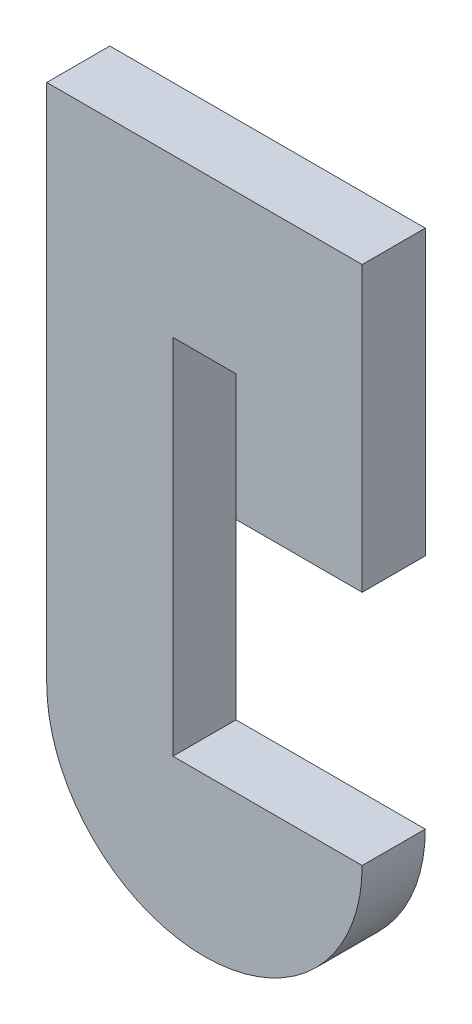
ISO-10303-21;
HEADER;
FILE_DESCRIPTION(('STEP AP214'),'2;1');
FILE_NAME('part.step','',(''),(''),'','','');
FILE_SCHEMA(('AUTOMOTIVE_DESIGN { 1 0 10303 214 1 1 1 1 }'));
ENDSEC;
DATA;
#1=APPLICATION_CONTEXT('core data for automotive mechanical design processes');
#2=APPLICATION_PROTOCOL_DEFINITION('international standard','automotive_design',2000,#1);
#3=PRODUCT_CONTEXT('',#1,'mechanical');
#4=PRODUCT('Part','Part','',(#3));
#5=PRODUCT_RELATED_PRODUCT_CATEGORY('part','',(#4));
#6=PRODUCT_DEFINITION_FORMATION('','',#4);
#7=PRODUCT_DEFINITION_CONTEXT('part definition',#1,'design');
#8=PRODUCT_DEFINITION('design','',#6,#7);
#9=PRODUCT_DEFINITION_SHAPE('','',#8);
#10=(LENGTH_UNIT() NAMED_UNIT(*) SI_UNIT(.MILLI.,.METRE.));
#11=(NAMED_UNIT(*) PLANE_ANGLE_UNIT() SI_UNIT($,.RADIAN.));
#12=(NAMED_UNIT(*) SI_UNIT($,.STERADIAN.) SOLID_ANGLE_UNIT());
#13=UNCERTAINTY_MEASURE_WITH_UNIT(LENGTH_MEASURE(1.E-05),#10,'distance_accuracy_value','');
#14=(GEOMETRIC_REPRESENTATION_CONTEXT(3) GLOBAL_UNCERTAINTY_ASSIGNED_CONTEXT((#13)) GLOBAL_UNIT_ASSIGNED_CONTEXT((#10,
#11,#12)) REPRESENTATION_CONTEXT('',''));
#15=CARTESIAN_POINT('',(0.,0.,0.));
#16=DIRECTION('',(0.,0.,1.));
#17=DIRECTION('',(1.,0.,0.));
#18=AXIS2_PLACEMENT_3D('',#15,#16,#17);
#19=CARTESIAN_POINT('',(12.7,-27.305,5.08));
#20=DIRECTION('',(-1.,0.,0.));
#21=DIRECTION('',(0.,0.,1.));
#22=AXIS2_PLACEMENT_3D('',#19,#20,#21);
#23=PLANE('',#22);
#24=DIRECTION('',(0.,1.,0.));
#25=VECTOR('',#24,1.);
#26=CARTESIAN_POINT('',(12.7,-27.305,5.08));
#27=LINE('',#26,#25);
#28=CARTESIAN_POINT('',(12.7,4.445,5.08));
#29=VERTEX_POINT('',#28);
#30=CARTESIAN_POINT('',(12.7,27.305,5.08));
#31=VERTEX_POINT('',#30);
#32=EDGE_CURVE('E143',#29,#31,#27,.T.);
#33=ORIENTED_EDGE('',*,*,#32,.F.);
#34=DIRECTION('',(0.,0.,1.));
#35=VECTOR('',#34,1.);
#36=CARTESIAN_POINT('',(12.7,4.445,-7.62));
#37=LINE('',#36,#35);
#38=CARTESIAN_POINT('',(12.7,4.445,0.));
#39=VERTEX_POINT('',#38);
#40=EDGE_CURVE('E126',#39,#29,#37,.T.);
#41=ORIENTED_EDGE('',*,*,#40,.F.);
#42=DIRECTION('',(0.,1.,0.));
#43=VECTOR('',#42,1.);
#44=CARTESIAN_POINT('',(12.7,-27.305,0.));
#45=LINE('',#44,#43);
#46=CARTESIAN_POINT('',(12.7,27.305,0.));
#47=VERTEX_POINT('',#46);
#48=EDGE_CURVE('E151',#39,#47,#45,.T.);
#49=ORIENTED_EDGE('',*,*,#48,.T.);
#50=DIRECTION('',(0.,0.,-1.));
#51=VECTOR('',#50,1.);
#52=CARTESIAN_POINT('',(12.7,27.305,5.08));
#53=LINE('',#52,#51);
#54=EDGE_CURVE('E159',#31,#47,#53,.T.);
#55=ORIENTED_EDGE('',*,*,#54,.F.);
#56=EDGE_LOOP('',(#33,#41,#49,#55));
#57=FACE_BOUND('',#56,.T.);
#58=ADVANCED_FACE('F32',(#57),#23,.F.);
#59=CARTESIAN_POINT('',(-12.7,27.305,5.08));
#60=DIRECTION('',(0.,-1.,0.));
#61=DIRECTION('',(0.,0.,-1.));
#62=AXIS2_PLACEMENT_3D('',#59,#60,#61);
#63=PLANE('',#62);
#64=DIRECTION('',(-1.,0.,0.));
#65=VECTOR('',#64,1.);
#66=CARTESIAN_POINT('',(-12.7,27.305,0.));
#67=LINE('',#66,#65);
#68=CARTESIAN_POINT('',(-12.7,27.305,0.));
#69=VERTEX_POINT('',#68);
#70=EDGE_CURVE('E153',#47,#69,#67,.T.);
#71=ORIENTED_EDGE('',*,*,#70,.T.);
#72=DIRECTION('',(0.,0.,-1.));
#73=VECTOR('',#72,1.);
#74=CARTESIAN_POINT('',(-12.7,27.305,5.08));
#75=LINE('',#74,#73);
#76=CARTESIAN_POINT('',(-12.7,27.305,5.08));
#77=VERTEX_POINT('',#76);
#78=EDGE_CURVE('E150',#77,#69,#75,.T.);
#79=ORIENTED_EDGE('',*,*,#78,.F.);
#80=DIRECTION('',(-1.,0.,0.));
#81=VECTOR('',#80,1.);
#82=CARTESIAN_POINT('',(-12.7,27.305,5.08));
#83=LINE('',#82,#81);
#84=EDGE_CURVE('E145',#31,#77,#83,.T.);
#85=ORIENTED_EDGE('',*,*,#84,.F.);
#86=ORIENTED_EDGE('',*,*,#54,.T.);
#87=EDGE_LOOP('',(#71,#79,#85,#86));
#88=FACE_BOUND('',#87,.T.);
#89=ADVANCED_FACE('F198',(#88),#63,.F.);
#90=CARTESIAN_POINT('',(-12.7,-27.305,5.08));
#91=DIRECTION('',(1.,0.,0.));
#92=DIRECTION('',(0.,0.,-1.));
#93=AXIS2_PLACEMENT_3D('',#90,#91,#92);
#94=PLANE('',#93);
#95=DIRECTION('',(0.,-1.,0.));
#96=VECTOR('',#95,1.);
#97=CARTESIAN_POINT('',(-12.7,-27.305,0.));
#98=LINE('',#97,#96);
#99=CARTESIAN_POINT('',(-12.7,-14.605,0.));
#100=VERTEX_POINT('',#99);
#101=EDGE_CURVE('E146',#69,#100,#98,.T.);
#102=ORIENTED_EDGE('',*,*,#101,.T.);
#103=DIRECTION('',(0.,0.,-1.));
#104=VECTOR('',#103,1.);
#105=CARTESIAN_POINT('',(-12.7,-14.605,5.08));
#106=LINE('',#105,#104);
#107=CARTESIAN_POINT('',(-12.7,-14.605,5.08));
#108=VERTEX_POINT('',#107);
#109=EDGE_CURVE('E171',#100,#108,#106,.F.);
#110=ORIENTED_EDGE('',*,*,#109,.T.);
#111=DIRECTION('',(0.,-1.,0.));
#112=VECTOR('',#111,1.);
#113=CARTESIAN_POINT('',(-12.7,-27.305,5.08));
#114=LINE('',#113,#112);
#115=EDGE_CURVE('E148',#77,#108,#114,.T.);
#116=ORIENTED_EDGE('',*,*,#115,.F.);
#117=ORIENTED_EDGE('',*,*,#78,.T.);
#118=EDGE_LOOP('',(#102,#110,#116,#117));
#119=FACE_BOUND('',#118,.T.);
#120=ADVANCED_FACE('F202',(#119),#94,.F.);
#121=CARTESIAN_POINT('',(0.,0.,5.08));
#122=DIRECTION('',(0.,0.,-1.));
#123=DIRECTION('',(-1.,0.,0.));
#124=AXIS2_PLACEMENT_3D('',#121,#122,#123);
#125=PLANE('',#124);
#126=DIRECTION('',(0.,-1.,0.));
#127=VECTOR('',#126,1.);
#128=CARTESIAN_POINT('',(-2.54,-14.605,5.08));
#129=LINE('',#128,#127);
#130=CARTESIAN_POINT('',(-2.54,14.605,5.08));
#131=VERTEX_POINT('',#130);
#132=CARTESIAN_POINT('',(-2.54,-14.605,5.08));
#133=VERTEX_POINT('',#132);
#134=EDGE_CURVE('E127',#131,#133,#129,.T.);
#135=ORIENTED_EDGE('',*,*,#134,.F.);
#136=DIRECTION('',(-1.,0.,0.));
#137=VECTOR('',#136,1.);
#138=CARTESIAN_POINT('',(-2.54,14.605,5.08));
#139=LINE('',#138,#137);
#140=CARTESIAN_POINT('',(2.54,14.605,5.08));
#141=VERTEX_POINT('',#140);
#142=EDGE_CURVE('E122',#141,#131,#139,.T.);
#143=ORIENTED_EDGE('',*,*,#142,.F.);
#144=DIRECTION('',(0.,1.,0.));
#145=VECTOR('',#144,1.);
#146=CARTESIAN_POINT('',(2.54,4.445,5.08));
#147=LINE('',#146,#145);
#148=CARTESIAN_POINT('',(2.54,4.445,5.08));
#149=VERTEX_POINT('',#148);
#150=EDGE_CURVE('E111',#149,#141,#147,.T.);
#151=ORIENTED_EDGE('',*,*,#150,.F.);
#152=DIRECTION('',(-1.,0.,0.));
#153=VECTOR('',#152,1.);
#154=CARTESIAN_POINT('',(12.7,4.445,5.08));
#155=LINE('',#154,#153);
#156=EDGE_CURVE('E119',#29,#149,#155,.T.);
#157=ORIENTED_EDGE('',*,*,#156,.F.);
#158=ORIENTED_EDGE('',*,*,#32,.T.);
#159=ORIENTED_EDGE('',*,*,#84,.T.);
#160=ORIENTED_EDGE('',*,*,#115,.T.);
#161=CARTESIAN_POINT('',(0.,-14.605,5.08));
#162=DIRECTION('',(0.,0.,-1.));
#163=DIRECTION('',(-1.,0.,0.));
#164=AXIS2_PLACEMENT_3D('',#161,#162,#163);
#165=CIRCLE('',#164,12.7);
#166=CARTESIAN_POINT('',(0.,-27.305,5.08));
#167=VERTEX_POINT('',#166);
#168=EDGE_CURVE('E55',#108,#167,#165,.F.);
#169=ORIENTED_EDGE('',*,*,#168,.T.);
#170=CARTESIAN_POINT('',(0.,-14.605,5.08));
#171=DIRECTION('',(0.,0.,-1.));
#172=DIRECTION('',(-1.,0.,0.));
#173=AXIS2_PLACEMENT_3D('',#170,#171,#172);
#174=CIRCLE('',#173,12.7);
#175=CARTESIAN_POINT('',(12.7,-14.605,5.08));
#176=VERTEX_POINT('',#175);
#177=EDGE_CURVE('E169',#167,#176,#174,.F.);
#178=ORIENTED_EDGE('',*,*,#177,.T.);
#179=DIRECTION('',(1.,0.,0.));
#180=VECTOR('',#179,1.);
#181=CARTESIAN_POINT('',(12.7,-14.605,5.08));
#182=LINE('',#181,#180);
#183=EDGE_CURVE('E130',#133,#176,#182,.T.);
#184=ORIENTED_EDGE('',*,*,#183,.F.);
#185=EDGE_LOOP('',(#135,#143,#151,#157,#158,#159,#160,#169,#178,#184));
#186=FACE_BOUND('',#185,.T.);
#187=ADVANCED_FACE('F118',(#186),#125,.F.);
#188=CARTESIAN_POINT('',(0.,0.,0.));
#189=DIRECTION('',(0.,0.,-1.));
#190=DIRECTION('',(-1.,0.,0.));
#191=AXIS2_PLACEMENT_3D('',#188,#189,#190);
#192=PLANE('',#191);
#193=DIRECTION('',(1.,0.,0.));
#194=VECTOR('',#193,1.);
#195=CARTESIAN_POINT('',(0.,14.605,0.));
#196=LINE('',#195,#194);
#197=CARTESIAN_POINT('',(-2.54,14.605,0.));
#198=VERTEX_POINT('',#197);
#199=CARTESIAN_POINT('',(2.54,14.605,0.));
#200=VERTEX_POINT('',#199);
#201=EDGE_CURVE('E11',#198,#200,#196,.T.);
#202=ORIENTED_EDGE('',*,*,#201,.F.);
#203=DIRECTION('',(0.,1.,0.));
#204=VECTOR('',#203,1.);
#205=CARTESIAN_POINT('',(-2.54,0.,0.));
#206=LINE('',#205,#204);
#207=CARTESIAN_POINT('',(-2.54,-14.605,0.));
#208=VERTEX_POINT('',#207);
#209=EDGE_CURVE('E116',#208,#198,#206,.T.);
#210=ORIENTED_EDGE('',*,*,#209,.F.);
#211=DIRECTION('',(-1.,0.,0.));
#212=VECTOR('',#211,1.);
#213=CARTESIAN_POINT('',(0.,-14.605,0.));
#214=LINE('',#213,#212);
#215=CARTESIAN_POINT('',(12.7,-14.605,0.));
#216=VERTEX_POINT('',#215);
#217=EDGE_CURVE('E139',#216,#208,#214,.T.);
#218=ORIENTED_EDGE('',*,*,#217,.F.);
#219=CARTESIAN_POINT('',(0.,-14.605,0.));
#220=DIRECTION('',(0.,0.,-1.));
#221=DIRECTION('',(-1.,0.,0.));
#222=AXIS2_PLACEMENT_3D('',#219,#220,#221);
#223=CIRCLE('',#222,12.7);
#224=CARTESIAN_POINT('',(0.,-27.305,0.));
#225=VERTEX_POINT('',#224);
#226=EDGE_CURVE('E166',#216,#225,#223,.T.);
#227=ORIENTED_EDGE('',*,*,#226,.T.);
#228=CARTESIAN_POINT('',(0.,-14.605,0.));
#229=DIRECTION('',(0.,0.,-1.));
#230=DIRECTION('',(-1.,0.,0.));
#231=AXIS2_PLACEMENT_3D('',#228,#229,#230);
#232=CIRCLE('',#231,12.7);
#233=EDGE_CURVE('E164',#225,#100,#232,.T.);
#234=ORIENTED_EDGE('',*,*,#233,.T.);
#235=ORIENTED_EDGE('',*,*,#101,.F.);
#236=ORIENTED_EDGE('',*,*,#70,.F.);
#237=ORIENTED_EDGE('',*,*,#48,.F.);
#238=DIRECTION('',(1.,0.,0.));
#239=VECTOR('',#238,1.);
#240=CARTESIAN_POINT('',(0.,4.445,0.));
#241=LINE('',#240,#239);
#242=CARTESIAN_POINT('',(2.54,4.445,0.));
#243=VERTEX_POINT('',#242);
#244=EDGE_CURVE('E173',#243,#39,#241,.T.);
#245=ORIENTED_EDGE('',*,*,#244,.F.);
#246=DIRECTION('',(0.,-1.,0.));
#247=VECTOR('',#246,1.);
#248=CARTESIAN_POINT('',(2.54,0.,0.));
#249=LINE('',#248,#247);
#250=EDGE_CURVE('E47',#200,#243,#249,.T.);
#251=ORIENTED_EDGE('',*,*,#250,.F.);
#252=EDGE_LOOP('',(#202,#210,#218,#227,#234,#235,#236,#237,#245,#251));
#253=FACE_BOUND('',#252,.T.);
#254=ADVANCED_FACE('F190',(#253),#192,.T.);
#255=CARTESIAN_POINT('',(0.,-14.605,5.08));
#256=DIRECTION('',(0.,0.,-1.));
#257=DIRECTION('',(-1.,0.,0.));
#258=AXIS2_PLACEMENT_3D('',#255,#256,#257);
#259=CYLINDRICAL_SURFACE('',#258,12.7);
#260=DIRECTION('',(0.,0.,-1.));
#261=VECTOR('',#260,1.);
#262=CARTESIAN_POINT('',(0.,-27.305,5.08));
#263=LINE('',#262,#261);
#264=EDGE_CURVE('E142',#167,#225,#263,.T.);
#265=ORIENTED_EDGE('',*,*,#264,.F.);
#266=ORIENTED_EDGE('',*,*,#168,.F.);
#267=ORIENTED_EDGE('',*,*,#109,.F.);
#268=ORIENTED_EDGE('',*,*,#233,.F.);
#269=EDGE_LOOP('',(#265,#266,#267,#268));
#270=FACE_BOUND('',#269,.T.);
#271=ADVANCED_FACE('F34',(#270),#259,.T.);
#272=CARTESIAN_POINT('',(0.,-14.605,5.08));
#273=DIRECTION('',(0.,0.,-1.));
#274=DIRECTION('',(-1.,0.,0.));
#275=AXIS2_PLACEMENT_3D('',#272,#273,#274);
#276=CYLINDRICAL_SURFACE('',#275,12.7);
#277=ORIENTED_EDGE('',*,*,#177,.F.);
#278=ORIENTED_EDGE('',*,*,#264,.T.);
#279=ORIENTED_EDGE('',*,*,#226,.F.);
#280=DIRECTION('',(0.,0.,-1.));
#281=VECTOR('',#280,1.);
#282=CARTESIAN_POINT('',(12.7,-14.605,5.08));
#283=LINE('',#282,#281);
#284=EDGE_CURVE('E162',#176,#216,#283,.T.);
#285=ORIENTED_EDGE('',*,*,#284,.F.);
#286=EDGE_LOOP('',(#277,#278,#279,#285));
#287=FACE_BOUND('',#286,.T.);
#288=ADVANCED_FACE('F210',(#287),#276,.T.);
#289=CARTESIAN_POINT('',(12.7,-14.605,-7.62));
#290=DIRECTION('',(0.,-1.,0.));
#291=DIRECTION('',(1.,0.,0.));
#292=AXIS2_PLACEMENT_3D('',#289,#290,#291);
#293=PLANE('',#292);
#294=ORIENTED_EDGE('',*,*,#217,.T.);
#295=DIRECTION('',(0.,0.,1.));
#296=VECTOR('',#295,1.);
#297=CARTESIAN_POINT('',(-2.54,-14.605,-7.62));
#298=LINE('',#297,#296);
#299=EDGE_CURVE('E137',#208,#133,#298,.T.);
#300=ORIENTED_EDGE('',*,*,#299,.T.);
#301=ORIENTED_EDGE('',*,*,#183,.T.);
#302=ORIENTED_EDGE('',*,*,#284,.T.);
#303=EDGE_LOOP('',(#294,#300,#301,#302));
#304=FACE_BOUND('',#303,.T.);
#305=ADVANCED_FACE('F213',(#304),#293,.F.);
#306=CARTESIAN_POINT('',(-2.54,-14.605,-7.62));
#307=DIRECTION('',(-1.,0.,0.));
#308=DIRECTION('',(0.,0.,1.));
#309=AXIS2_PLACEMENT_3D('',#306,#307,#308);
#310=PLANE('',#309);
#311=ORIENTED_EDGE('',*,*,#209,.T.);
#312=DIRECTION('',(0.,0.,1.));
#313=VECTOR('',#312,1.);
#314=CARTESIAN_POINT('',(-2.54,14.605,-7.62));
#315=LINE('',#314,#313);
#316=EDGE_CURVE('E132',#198,#131,#315,.T.);
#317=ORIENTED_EDGE('',*,*,#316,.T.);
#318=ORIENTED_EDGE('',*,*,#134,.T.);
#319=ORIENTED_EDGE('',*,*,#299,.F.);
#320=EDGE_LOOP('',(#311,#317,#318,#319));
#321=FACE_BOUND('',#320,.T.);
#322=ADVANCED_FACE('F182',(#321),#310,.F.);
#323=CARTESIAN_POINT('',(12.7,4.445,-7.62));
#324=DIRECTION('',(0.,1.,0.));
#325=DIRECTION('',(-1.,0.,0.));
#326=AXIS2_PLACEMENT_3D('',#323,#324,#325);
#327=PLANE('',#326);
#328=ORIENTED_EDGE('',*,*,#156,.T.);
#329=DIRECTION('',(0.,0.,-1.));
#330=VECTOR('',#329,1.);
#331=CARTESIAN_POINT('',(2.54,4.445,-7.62));
#332=LINE('',#331,#330);
#333=EDGE_CURVE('E40',#149,#243,#332,.T.);
#334=ORIENTED_EDGE('',*,*,#333,.T.);
#335=ORIENTED_EDGE('',*,*,#244,.T.);
#336=ORIENTED_EDGE('',*,*,#40,.T.);
#337=EDGE_LOOP('',(#328,#334,#335,#336));
#338=FACE_BOUND('',#337,.T.);
#339=ADVANCED_FACE('F124',(#338),#327,.F.);
#340=CARTESIAN_POINT('',(-2.54,14.605,-7.62));
#341=DIRECTION('',(0.,1.,0.));
#342=DIRECTION('',(0.,0.,1.));
#343=AXIS2_PLACEMENT_3D('',#340,#341,#342);
#344=PLANE('',#343);
#345=ORIENTED_EDGE('',*,*,#201,.T.);
#346=DIRECTION('',(0.,0.,1.));
#347=VECTOR('',#346,1.);
#348=CARTESIAN_POINT('',(2.54,14.605,-7.62));
#349=LINE('',#348,#347);
#350=EDGE_CURVE('E188',#200,#141,#349,.T.);
#351=ORIENTED_EDGE('',*,*,#350,.T.);
#352=ORIENTED_EDGE('',*,*,#142,.T.);
#353=ORIENTED_EDGE('',*,*,#316,.F.);
#354=EDGE_LOOP('',(#345,#351,#352,#353));
#355=FACE_BOUND('',#354,.T.);
#356=ADVANCED_FACE('F187',(#355),#344,.F.);
#357=CARTESIAN_POINT('',(2.54,4.445,-7.62));
#358=DIRECTION('',(1.,0.,0.));
#359=DIRECTION('',(0.,1.,0.));
#360=AXIS2_PLACEMENT_3D('',#357,#358,#359);
#361=PLANE('',#360);
#362=ORIENTED_EDGE('',*,*,#250,.T.);
#363=ORIENTED_EDGE('',*,*,#333,.F.);
#364=ORIENTED_EDGE('',*,*,#150,.T.);
#365=ORIENTED_EDGE('',*,*,#350,.F.);
#366=EDGE_LOOP('',(#362,#363,#364,#365));
#367=FACE_BOUND('',#366,.T.);
#368=ADVANCED_FACE('F110',(#367),#361,.F.);
#369=CLOSED_SHELL('',(#58,#89,#120,#187,#254,#271,#288,#305,#322,#339,#356,#368));
#370=MANIFOLD_SOLID_BREP('B2',#369);
#371=ADVANCED_BREP_SHAPE_REPRESENTATION('',(#18,#370),#14);
#372=SHAPE_DEFINITION_REPRESENTATION(#9,#371);
ENDSEC;
END-ISO-10303-21;
